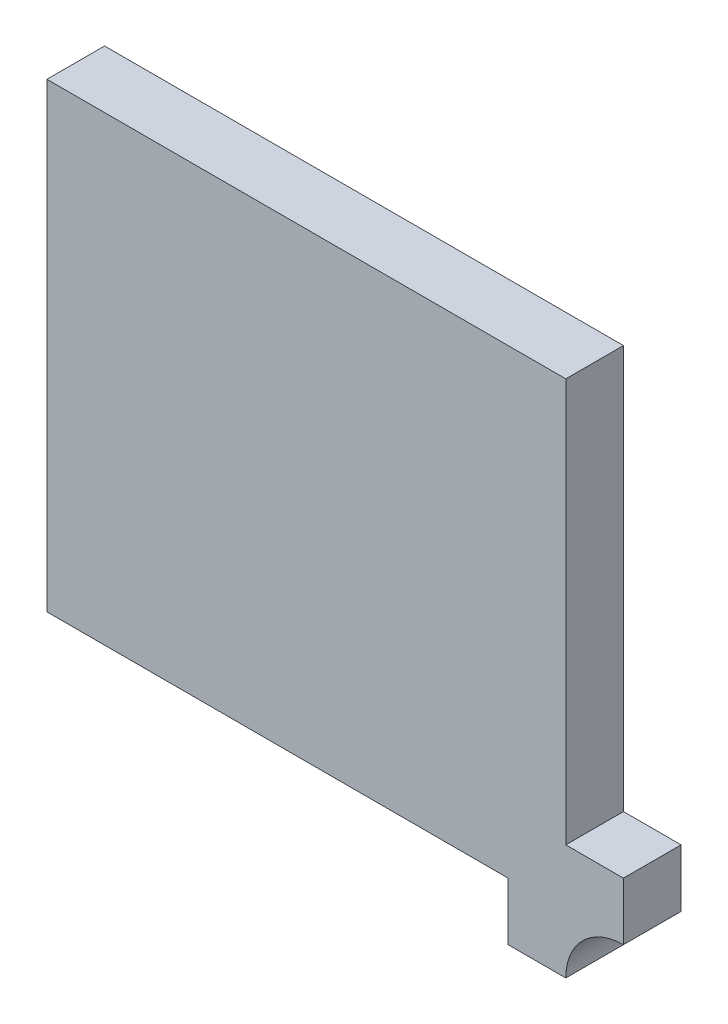
ISO-10303-21;
HEADER;
FILE_DESCRIPTION(('STEP AP214'),'2;1');
FILE_NAME('part.step','',(''),(''),'','','');
FILE_SCHEMA(('AUTOMOTIVE_DESIGN { 1 0 10303 214 1 1 1 1 }'));
ENDSEC;
DATA;
#1=APPLICATION_CONTEXT('core data for automotive mechanical design processes');
#2=APPLICATION_PROTOCOL_DEFINITION('international standard','automotive_design',2000,#1);
#3=PRODUCT_CONTEXT('',#1,'mechanical');
#4=PRODUCT('Part','Part','',(#3));
#5=PRODUCT_RELATED_PRODUCT_CATEGORY('part','',(#4));
#6=PRODUCT_DEFINITION_FORMATION('','',#4);
#7=PRODUCT_DEFINITION_CONTEXT('part definition',#1,'design');
#8=PRODUCT_DEFINITION('design','',#6,#7);
#9=PRODUCT_DEFINITION_SHAPE('','',#8);
#10=(LENGTH_UNIT() NAMED_UNIT(*) SI_UNIT(.MILLI.,.METRE.));
#11=(NAMED_UNIT(*) PLANE_ANGLE_UNIT() SI_UNIT($,.RADIAN.));
#12=(NAMED_UNIT(*) SI_UNIT($,.STERADIAN.) SOLID_ANGLE_UNIT());
#13=UNCERTAINTY_MEASURE_WITH_UNIT(LENGTH_MEASURE(1.E-05),#10,'distance_accuracy_value','');
#14=(GEOMETRIC_REPRESENTATION_CONTEXT(3) GLOBAL_UNCERTAINTY_ASSIGNED_CONTEXT((#13)) GLOBAL_UNIT_ASSIGNED_CONTEXT((#10,
#11,#12)) REPRESENTATION_CONTEXT('',''));
#15=CARTESIAN_POINT('',(0.,0.,0.));
#16=DIRECTION('',(0.,0.,1.));
#17=DIRECTION('',(1.,0.,0.));
#18=AXIS2_PLACEMENT_3D('',#15,#16,#17);
#19=CARTESIAN_POINT('',(1.6,-1.25,0.));
#20=DIRECTION('',(0.,0.,-1.));
#21=DIRECTION('',(-1.,0.,0.));
#22=AXIS2_PLACEMENT_3D('',#19,#20,#21);
#23=PLANE('',#22);
#24=DIRECTION('',(1.,0.,0.));
#25=VECTOR('',#24,1.);
#26=CARTESIAN_POINT('',(1.6,-1.05,0.));
#27=LINE('',#26,#25);
#28=CARTESIAN_POINT('',(1.6,-1.05,0.));
#29=VERTEX_POINT('',#28);
#30=CARTESIAN_POINT('',(1.5,-1.05,0.));
#31=VERTEX_POINT('',#30);
#32=EDGE_CURVE('E173',#29,#31,#27,.F.);
#33=ORIENTED_EDGE('',*,*,#32,.F.);
#34=DIRECTION('',(0.,1.,0.));
#35=VECTOR('',#34,1.);
#36=CARTESIAN_POINT('',(1.6,-1.15,0.));
#37=LINE('',#36,#35);
#38=CARTESIAN_POINT('',(1.6,-1.15,0.));
#39=VERTEX_POINT('',#38);
#40=EDGE_CURVE('E90',#39,#29,#37,.T.);
#41=ORIENTED_EDGE('',*,*,#40,.F.);
#42=CARTESIAN_POINT('',(1.6,-1.25,0.));
#43=DIRECTION('',(0.,0.,-1.));
#44=DIRECTION('',(-1.,0.,0.));
#45=AXIS2_PLACEMENT_3D('',#42,#43,#44);
#46=CIRCLE('',#45,0.1);
#47=CARTESIAN_POINT('',(1.5,-1.25,0.));
#48=VERTEX_POINT('',#47);
#49=EDGE_CURVE('E19',#39,#48,#46,.F.);
#50=ORIENTED_EDGE('',*,*,#49,.T.);
#51=DIRECTION('',(1.,0.,0.));
#52=VECTOR('',#51,1.);
#53=CARTESIAN_POINT('',(1.4,-1.25,0.));
#54=LINE('',#53,#52);
#55=CARTESIAN_POINT('',(1.4,-1.25,0.));
#56=VERTEX_POINT('',#55);
#57=EDGE_CURVE('E87',#56,#48,#54,.T.);
#58=ORIENTED_EDGE('',*,*,#57,.F.);
#59=DIRECTION('',(0.,1.,0.));
#60=VECTOR('',#59,1.);
#61=CARTESIAN_POINT('',(1.4,-1.25,0.));
#62=LINE('',#61,#60);
#63=CARTESIAN_POINT('',(1.4,-1.15,0.));
#64=VERTEX_POINT('',#63);
#65=EDGE_CURVE('E99',#64,#56,#62,.F.);
#66=ORIENTED_EDGE('',*,*,#65,.F.);
#67=DIRECTION('',(1.,0.,0.));
#68=VECTOR('',#67,1.);
#69=CARTESIAN_POINT('',(1.4,-1.15,0.));
#70=LINE('',#69,#68);
#71=CARTESIAN_POINT('',(0.6,-1.15,0.));
#72=VERTEX_POINT('',#71);
#73=EDGE_CURVE('E125',#72,#64,#70,.T.);
#74=ORIENTED_EDGE('',*,*,#73,.F.);
#75=DIRECTION('',(0.,1.,0.));
#76=VECTOR('',#75,1.);
#77=CARTESIAN_POINT('',(0.6,-0.35,0.));
#78=LINE('',#77,#76);
#79=CARTESIAN_POINT('',(0.6,-0.35,0.));
#80=VERTEX_POINT('',#79);
#81=EDGE_CURVE('E136',#80,#72,#78,.F.);
#82=ORIENTED_EDGE('',*,*,#81,.F.);
#83=DIRECTION('',(1.,0.,0.));
#84=VECTOR('',#83,1.);
#85=CARTESIAN_POINT('',(1.5,-0.35,0.));
#86=LINE('',#85,#84);
#87=CARTESIAN_POINT('',(1.5,-0.35,0.));
#88=VERTEX_POINT('',#87);
#89=EDGE_CURVE('E147',#88,#80,#86,.F.);
#90=ORIENTED_EDGE('',*,*,#89,.F.);
#91=DIRECTION('',(0.,1.,0.));
#92=VECTOR('',#91,1.);
#93=CARTESIAN_POINT('',(1.5,-1.05,0.));
#94=LINE('',#93,#92);
#95=EDGE_CURVE('E157',#31,#88,#94,.T.);
#96=ORIENTED_EDGE('',*,*,#95,.F.);
#97=EDGE_LOOP('',(#33,#41,#50,#58,#66,#74,#82,#90,#96));
#98=FACE_BOUND('',#97,.T.);
#99=ADVANCED_FACE('F16',(#98),#23,.T.);
#100=CARTESIAN_POINT('',(1.5,-0.35,0.));
#101=DIRECTION('',(0.,1.,0.));
#102=DIRECTION('',(0.,0.,1.));
#103=AXIS2_PLACEMENT_3D('',#100,#101,#102);
#104=PLANE('',#103);
#105=DIRECTION('',(0.,0.,1.));
#106=VECTOR('',#105,1.);
#107=CARTESIAN_POINT('',(0.6,-0.35,0.));
#108=LINE('',#107,#106);
#109=CARTESIAN_POINT('',(0.6,-0.35,0.1));
#110=VERTEX_POINT('',#109);
#111=EDGE_CURVE('E144',#110,#80,#108,.F.);
#112=ORIENTED_EDGE('',*,*,#111,.F.);
#113=DIRECTION('',(1.,0.,0.));
#114=VECTOR('',#113,1.);
#115=CARTESIAN_POINT('',(1.6,-0.35,0.1));
#116=LINE('',#115,#114);
#117=CARTESIAN_POINT('',(1.5,-0.35,0.1));
#118=VERTEX_POINT('',#117);
#119=EDGE_CURVE('E141',#118,#110,#116,.F.);
#120=ORIENTED_EDGE('',*,*,#119,.F.);
#121=DIRECTION('',(0.,0.,-1.));
#122=VECTOR('',#121,1.);
#123=CARTESIAN_POINT('',(1.5,-0.35,0.));
#124=LINE('',#123,#122);
#125=EDGE_CURVE('E152',#88,#118,#124,.F.);
#126=ORIENTED_EDGE('',*,*,#125,.F.);
#127=ORIENTED_EDGE('',*,*,#89,.T.);
#128=EDGE_LOOP('',(#112,#120,#126,#127));
#129=FACE_BOUND('',#128,.T.);
#130=ADVANCED_FACE('F215',(#129),#104,.T.);
#131=CARTESIAN_POINT('',(0.6,-0.35,0.));
#132=DIRECTION('',(-1.,0.,0.));
#133=DIRECTION('',(0.,0.,1.));
#134=AXIS2_PLACEMENT_3D('',#131,#132,#133);
#135=PLANE('',#134);
#136=ORIENTED_EDGE('',*,*,#81,.T.);
#137=DIRECTION('',(0.,0.,-1.));
#138=VECTOR('',#137,1.);
#139=CARTESIAN_POINT('',(0.6,-1.15,0.));
#140=LINE('',#139,#138);
#141=CARTESIAN_POINT('',(0.6,-1.15,0.1));
#142=VERTEX_POINT('',#141);
#143=EDGE_CURVE('E133',#142,#72,#140,.T.);
#144=ORIENTED_EDGE('',*,*,#143,.F.);
#145=DIRECTION('',(0.,1.,0.));
#146=VECTOR('',#145,1.);
#147=CARTESIAN_POINT('',(0.6,-1.25,0.1));
#148=LINE('',#147,#146);
#149=EDGE_CURVE('E130',#110,#142,#148,.F.);
#150=ORIENTED_EDGE('',*,*,#149,.F.);
#151=ORIENTED_EDGE('',*,*,#111,.T.);
#152=EDGE_LOOP('',(#136,#144,#150,#151));
#153=FACE_BOUND('',#152,.T.);
#154=ADVANCED_FACE('F219',(#153),#135,.T.);
#155=CARTESIAN_POINT('',(1.4,-1.15,0.));
#156=DIRECTION('',(0.,-1.,0.));
#157=DIRECTION('',(0.,0.,-1.));
#158=AXIS2_PLACEMENT_3D('',#155,#156,#157);
#159=PLANE('',#158);
#160=DIRECTION('',(0.,0.,1.));
#161=VECTOR('',#160,1.);
#162=CARTESIAN_POINT('',(1.4,-1.15,0.));
#163=LINE('',#162,#161);
#164=CARTESIAN_POINT('',(1.4,-1.15,0.1));
#165=VERTEX_POINT('',#164);
#166=EDGE_CURVE('E122',#165,#64,#163,.F.);
#167=ORIENTED_EDGE('',*,*,#166,.F.);
#168=DIRECTION('',(1.,0.,0.));
#169=VECTOR('',#168,1.);
#170=CARTESIAN_POINT('',(1.6,-1.15,0.1));
#171=LINE('',#170,#169);
#172=EDGE_CURVE('E119',#142,#165,#171,.T.);
#173=ORIENTED_EDGE('',*,*,#172,.F.);
#174=ORIENTED_EDGE('',*,*,#143,.T.);
#175=ORIENTED_EDGE('',*,*,#73,.T.);
#176=EDGE_LOOP('',(#167,#173,#174,#175));
#177=FACE_BOUND('',#176,.T.);
#178=ADVANCED_FACE('F223',(#177),#159,.T.);
#179=CARTESIAN_POINT('',(1.4,-1.25,0.));
#180=DIRECTION('',(-1.,0.,0.));
#181=DIRECTION('',(0.,0.,1.));
#182=AXIS2_PLACEMENT_3D('',#179,#180,#181);
#183=PLANE('',#182);
#184=ORIENTED_EDGE('',*,*,#166,.T.);
#185=ORIENTED_EDGE('',*,*,#65,.T.);
#186=DIRECTION('',(0.,0.,-1.));
#187=VECTOR('',#186,1.);
#188=CARTESIAN_POINT('',(1.4,-1.25,0.));
#189=LINE('',#188,#187);
#190=CARTESIAN_POINT('',(1.4,-1.25,0.1));
#191=VERTEX_POINT('',#190);
#192=EDGE_CURVE('E93',#191,#56,#189,.T.);
#193=ORIENTED_EDGE('',*,*,#192,.F.);
#194=DIRECTION('',(0.,1.,0.));
#195=VECTOR('',#194,1.);
#196=CARTESIAN_POINT('',(1.4,-1.25,0.1));
#197=LINE('',#196,#195);
#198=EDGE_CURVE('E115',#165,#191,#197,.F.);
#199=ORIENTED_EDGE('',*,*,#198,.F.);
#200=EDGE_LOOP('',(#184,#185,#193,#199));
#201=FACE_BOUND('',#200,.T.);
#202=ADVANCED_FACE('F226',(#201),#183,.T.);
#203=CARTESIAN_POINT('',(1.4,-1.25,0.));
#204=DIRECTION('',(0.,-1.,0.));
#205=DIRECTION('',(0.,0.,-1.));
#206=AXIS2_PLACEMENT_3D('',#203,#204,#205);
#207=PLANE('',#206);
#208=DIRECTION('',(1.,0.,0.));
#209=VECTOR('',#208,1.);
#210=CARTESIAN_POINT('',(1.6,-1.25,0.1));
#211=LINE('',#210,#209);
#212=CARTESIAN_POINT('',(1.5,-1.25,0.1));
#213=VERTEX_POINT('',#212);
#214=EDGE_CURVE('E118',#191,#213,#211,.T.);
#215=ORIENTED_EDGE('',*,*,#214,.F.);
#216=ORIENTED_EDGE('',*,*,#192,.T.);
#217=ORIENTED_EDGE('',*,*,#57,.T.);
#218=DIRECTION('',(0.,0.,-1.));
#219=VECTOR('',#218,1.);
#220=CARTESIAN_POINT('',(1.5,-1.25,0.1));
#221=LINE('',#220,#219);
#222=EDGE_CURVE('E92',#48,#213,#221,.F.);
#223=ORIENTED_EDGE('',*,*,#222,.T.);
#224=EDGE_LOOP('',(#215,#216,#217,#223));
#225=FACE_BOUND('',#224,.T.);
#226=ADVANCED_FACE('F97',(#225),#207,.T.);
#227=CARTESIAN_POINT('',(1.6,-1.25,0.1));
#228=DIRECTION('',(0.,0.,-1.));
#229=DIRECTION('',(-1.,0.,0.));
#230=AXIS2_PLACEMENT_3D('',#227,#228,#229);
#231=CYLINDRICAL_SURFACE('',#230,0.1);
#232=CARTESIAN_POINT('',(1.6,-1.25,0.1));
#233=DIRECTION('',(0.,0.,-1.));
#234=DIRECTION('',(-1.,0.,0.));
#235=AXIS2_PLACEMENT_3D('',#232,#233,#234);
#236=CIRCLE('',#235,0.1);
#237=CARTESIAN_POINT('',(1.6,-1.15,0.1));
#238=VERTEX_POINT('',#237);
#239=EDGE_CURVE('E103',#213,#238,#236,.T.);
#240=ORIENTED_EDGE('',*,*,#239,.F.);
#241=ORIENTED_EDGE('',*,*,#222,.F.);
#242=ORIENTED_EDGE('',*,*,#49,.F.);
#243=DIRECTION('',(0.,0.,-1.));
#244=VECTOR('',#243,1.);
#245=CARTESIAN_POINT('',(1.6,-1.15,0.));
#246=LINE('',#245,#244);
#247=EDGE_CURVE('E105',#238,#39,#246,.T.);
#248=ORIENTED_EDGE('',*,*,#247,.F.);
#249=EDGE_LOOP('',(#240,#241,#242,#248));
#250=FACE_BOUND('',#249,.T.);
#251=ADVANCED_FACE('F101',(#250),#231,.F.);
#252=CARTESIAN_POINT('',(1.6,-1.15,0.));
#253=DIRECTION('',(1.,0.,0.));
#254=DIRECTION('',(0.,0.,-1.));
#255=AXIS2_PLACEMENT_3D('',#252,#253,#254);
#256=PLANE('',#255);
#257=ORIENTED_EDGE('',*,*,#247,.T.);
#258=ORIENTED_EDGE('',*,*,#40,.T.);
#259=DIRECTION('',(0.,0.,1.));
#260=VECTOR('',#259,1.);
#261=CARTESIAN_POINT('',(1.6,-1.05,0.));
#262=LINE('',#261,#260);
#263=CARTESIAN_POINT('',(1.6,-1.05,0.1));
#264=VERTEX_POINT('',#263);
#265=EDGE_CURVE('E170',#264,#29,#262,.F.);
#266=ORIENTED_EDGE('',*,*,#265,.F.);
#267=DIRECTION('',(0.,1.,0.));
#268=VECTOR('',#267,1.);
#269=CARTESIAN_POINT('',(1.6,-1.25,0.1));
#270=LINE('',#269,#268);
#271=EDGE_CURVE('E190',#238,#264,#270,.T.);
#272=ORIENTED_EDGE('',*,*,#271,.F.);
#273=EDGE_LOOP('',(#257,#258,#266,#272));
#274=FACE_BOUND('',#273,.T.);
#275=ADVANCED_FACE('F208',(#274),#256,.T.);
#276=CARTESIAN_POINT('',(1.6,-1.05,0.));
#277=DIRECTION('',(0.,1.,0.));
#278=DIRECTION('',(0.,0.,1.));
#279=AXIS2_PLACEMENT_3D('',#276,#277,#278);
#280=PLANE('',#279);
#281=DIRECTION('',(1.,0.,0.));
#282=VECTOR('',#281,1.);
#283=CARTESIAN_POINT('',(1.6,-1.05,0.1));
#284=LINE('',#283,#282);
#285=CARTESIAN_POINT('',(1.5,-1.05,0.1));
#286=VERTEX_POINT('',#285);
#287=EDGE_CURVE('E25',#264,#286,#284,.F.);
#288=ORIENTED_EDGE('',*,*,#287,.F.);
#289=ORIENTED_EDGE('',*,*,#265,.T.);
#290=ORIENTED_EDGE('',*,*,#32,.T.);
#291=DIRECTION('',(0.,0.,-1.));
#292=VECTOR('',#291,1.);
#293=CARTESIAN_POINT('',(1.5,-1.05,0.));
#294=LINE('',#293,#292);
#295=EDGE_CURVE('E34',#286,#31,#294,.T.);
#296=ORIENTED_EDGE('',*,*,#295,.F.);
#297=EDGE_LOOP('',(#288,#289,#290,#296));
#298=FACE_BOUND('',#297,.T.);
#299=ADVANCED_FACE('F204',(#298),#280,.T.);
#300=CARTESIAN_POINT('',(1.5,-1.05,0.));
#301=DIRECTION('',(1.,0.,0.));
#302=DIRECTION('',(0.,0.,-1.));
#303=AXIS2_PLACEMENT_3D('',#300,#301,#302);
#304=PLANE('',#303);
#305=ORIENTED_EDGE('',*,*,#95,.T.);
#306=ORIENTED_EDGE('',*,*,#125,.T.);
#307=DIRECTION('',(0.,1.,0.));
#308=VECTOR('',#307,1.);
#309=CARTESIAN_POINT('',(1.5,-1.25,0.1));
#310=LINE('',#309,#308);
#311=EDGE_CURVE('E11',#286,#118,#310,.T.);
#312=ORIENTED_EDGE('',*,*,#311,.F.);
#313=ORIENTED_EDGE('',*,*,#295,.T.);
#314=EDGE_LOOP('',(#305,#306,#312,#313));
#315=FACE_BOUND('',#314,.T.);
#316=ADVANCED_FACE('F212',(#315),#304,.T.);
#317=CARTESIAN_POINT('',(1.6,-1.25,0.1));
#318=DIRECTION('',(0.,0.,1.));
#319=DIRECTION('',(1.,0.,0.));
#320=AXIS2_PLACEMENT_3D('',#317,#318,#319);
#321=PLANE('',#320);
#322=ORIENTED_EDGE('',*,*,#287,.T.);
#323=ORIENTED_EDGE('',*,*,#311,.T.);
#324=ORIENTED_EDGE('',*,*,#119,.T.);
#325=ORIENTED_EDGE('',*,*,#149,.T.);
#326=ORIENTED_EDGE('',*,*,#172,.T.);
#327=ORIENTED_EDGE('',*,*,#198,.T.);
#328=ORIENTED_EDGE('',*,*,#214,.T.);
#329=ORIENTED_EDGE('',*,*,#239,.T.);
#330=ORIENTED_EDGE('',*,*,#271,.T.);
#331=EDGE_LOOP('',(#322,#323,#324,#325,#326,#327,#328,#329,#330));
#332=FACE_BOUND('',#331,.T.);
#333=ADVANCED_FACE('F209',(#332),#321,.T.);
#334=CLOSED_SHELL('',(#99,#130,#154,#178,#202,#226,#251,#275,#299,#316,#333));
#335=MANIFOLD_SOLID_BREP('B1',#334);
#336=ADVANCED_BREP_SHAPE_REPRESENTATION('',(#18,#335),#14);
#337=SHAPE_DEFINITION_REPRESENTATION(#9,#336);
ENDSEC;
END-ISO-10303-21;
